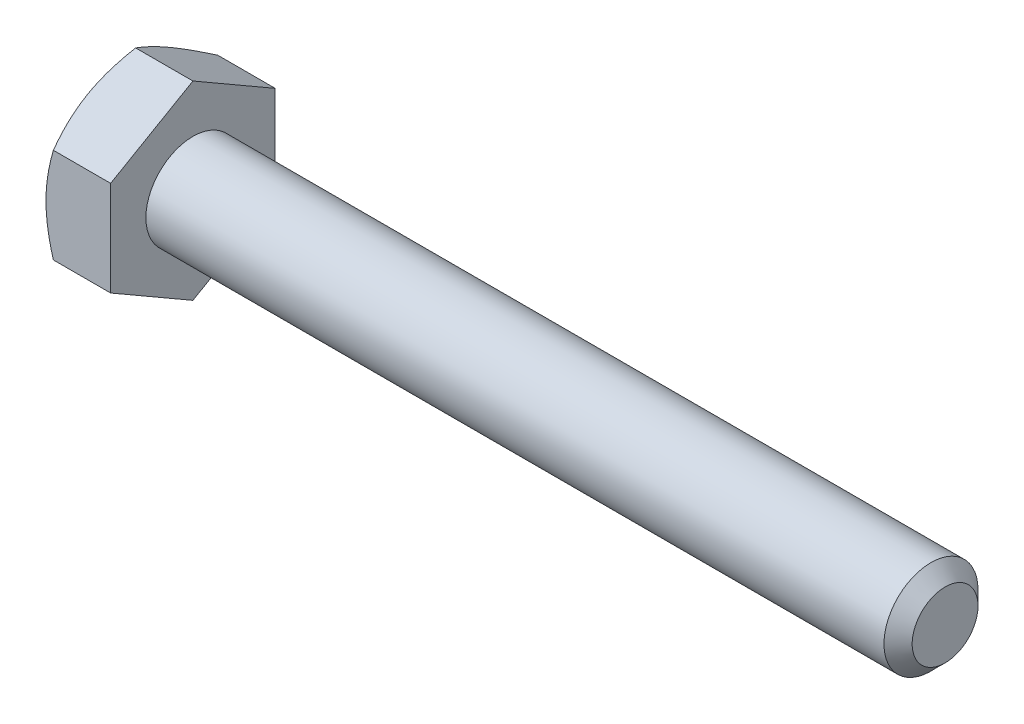
ISO-10303-21;
HEADER;
FILE_DESCRIPTION(('STEP AP214'),'2;1');
FILE_NAME('part.step','',(''),(''),'','','');
FILE_SCHEMA(('AUTOMOTIVE_DESIGN { 1 0 10303 214 1 1 1 1 }'));
ENDSEC;
DATA;
#1=APPLICATION_CONTEXT('core data for automotive mechanical design processes');
#2=APPLICATION_PROTOCOL_DEFINITION('international standard','automotive_design',2000,#1);
#3=PRODUCT_CONTEXT('',#1,'mechanical');
#4=PRODUCT('Part','Part','',(#3));
#5=PRODUCT_RELATED_PRODUCT_CATEGORY('part','',(#4));
#6=PRODUCT_DEFINITION_FORMATION('','',#4);
#7=PRODUCT_DEFINITION_CONTEXT('part definition',#1,'design');
#8=PRODUCT_DEFINITION('design','',#6,#7);
#9=PRODUCT_DEFINITION_SHAPE('','',#8);
#10=(LENGTH_UNIT() NAMED_UNIT(*) SI_UNIT(.MILLI.,.METRE.));
#11=(NAMED_UNIT(*) PLANE_ANGLE_UNIT() SI_UNIT($,.RADIAN.));
#12=(NAMED_UNIT(*) SI_UNIT($,.STERADIAN.) SOLID_ANGLE_UNIT());
#13=UNCERTAINTY_MEASURE_WITH_UNIT(LENGTH_MEASURE(1.E-05),#10,'distance_accuracy_value','');
#14=(GEOMETRIC_REPRESENTATION_CONTEXT(3) GLOBAL_UNCERTAINTY_ASSIGNED_CONTEXT((#13)) GLOBAL_UNIT_ASSIGNED_CONTEXT((#10,
#11,#12)) REPRESENTATION_CONTEXT('',''));
#15=CARTESIAN_POINT('',(0.,0.,0.));
#16=DIRECTION('',(0.,0.,1.));
#17=DIRECTION('',(1.,0.,0.));
#18=AXIS2_PLACEMENT_3D('',#15,#16,#17);
#19=CARTESIAN_POINT('',(-27.5828125,-3.20790243318486,5.55625));
#20=DIRECTION('',(0.,0.,-1.));
#21=DIRECTION('',(0.,1.,0.));
#22=AXIS2_PLACEMENT_3D('',#19,#20,#21);
#23=PLANE('',#22);
#24=CARTESIAN_POINT('',(-24.8093750574616,-8.74399028271724,5.55625));
#25=CARTESIAN_POINT('',(-24.9281476439003,-8.50018624433215,5.55625));
#26=CARTESIAN_POINT('',(-25.0458174877412,-8.25583594838018,5.55625));
#27=CARTESIAN_POINT('',(-25.2783338302931,-7.76575276181023,5.55625));
#28=CARTESIAN_POINT('',(-25.393179907504,-7.52001967143121,5.55625));
#29=CARTESIAN_POINT('',(-25.6199815650906,-7.02567502758554,5.55625));
#30=CARTESIAN_POINT('',(-25.7319190754759,-6.77705515601886,5.55625));
#31=CARTESIAN_POINT('',(-25.9513791438231,-6.27788161359691,5.55625));
#32=CARTESIAN_POINT('',(-26.0589019023311,-6.02732803119864,5.55625));
#33=CARTESIAN_POINT('',(-26.271906896146,-5.51539046667091,5.55625));
#34=CARTESIAN_POINT('',(-26.3771977000269,-5.25392641272659,5.55625));
#35=CARTESIAN_POINT('',(-26.5801139851458,-4.72798657849262,5.55625));
#36=CARTESIAN_POINT('',(-26.6777386244234,-4.46351047103702,5.55625));
#37=CARTESIAN_POINT('',(-26.8628532154484,-3.931581690416,5.55625));
#38=CARTESIAN_POINT('',(-26.9503626154158,-3.66413585057298,5.55625));
#39=CARTESIAN_POINT('',(-27.1125224423586,-3.12540698347402,5.55625));
#40=CARTESIAN_POINT('',(-27.187176786064,-2.85412515234023,5.55625));
#41=CARTESIAN_POINT('',(-27.3197361578849,-2.30908269853906,5.55625));
#42=CARTESIAN_POINT('',(-27.3777346690236,-2.03534517245376,5.55625));
#43=CARTESIAN_POINT('',(-27.4737733322196,-1.48429809984412,5.55625));
#44=CARTESIAN_POINT('',(-27.511815646564,-1.20698894364918,5.55625));
#45=CARTESIAN_POINT('',(-27.5513928026956,-0.791294728945893,5.55625));
#46=CARTESIAN_POINT('',(-27.561658902021,-0.65370820935704,5.55625));
#47=CARTESIAN_POINT('',(-27.576362187288,-0.378228688137562,5.55625));
#48=CARTESIAN_POINT('',(-27.5807999263983,-0.240335716836746,5.55625));
#49=CARTESIAN_POINT('',(-27.5837354775687,0.0355251316508514,5.55625));
#50=CARTESIAN_POINT('',(-27.5822327727923,0.173493014310982,5.55625));
#51=CARTESIAN_POINT('',(-27.5733265100424,0.4492284470335,5.55625));
#52=CARTESIAN_POINT('',(-27.5659231814189,0.586996004673772,5.55625));
#53=CARTESIAN_POINT('',(-27.5414869355163,0.914267817860304,5.55625));
#54=CARTESIAN_POINT('',(-27.5218672237309,1.10358331302688,5.55625));
#55=CARTESIAN_POINT('',(-27.4725268119308,1.48088314390515,5.55625));
#56=CARTESIAN_POINT('',(-27.4428048473206,1.66886730995275,5.55625));
#57=CARTESIAN_POINT('',(-27.3400555513119,2.23056094001761,5.55625));
#58=CARTESIAN_POINT('',(-27.2534606125147,2.60182550045217,5.55625));
#59=CARTESIAN_POINT('',(-27.1023261053987,3.15725729103479,5.55625));
#60=CARTESIAN_POINT('',(-27.0476586113424,3.34427702524158,5.55625));
#61=CARTESIAN_POINT('',(-26.932406052333,3.71650215163137,5.55625));
#62=CARTESIAN_POINT('',(-26.8718209419117,3.90170752986172,5.55625));
#63=CARTESIAN_POINT('',(-26.7457250457604,4.27035971442928,5.55625));
#64=CARTESIAN_POINT('',(-26.6802156550753,4.45380700235122,5.55625));
#65=CARTESIAN_POINT('',(-26.5450659129719,4.81916376783227,5.55625));
#66=CARTESIAN_POINT('',(-26.4754256552842,5.00107328017708,5.55625));
#67=CARTESIAN_POINT('',(-26.2830333948252,5.48965634412822,5.55625));
#68=CARTESIAN_POINT('',(-26.1570472750788,5.79505516029649,5.55625));
#69=CARTESIAN_POINT('',(-25.8976962832958,6.40271511827116,5.55625));
#70=CARTESIAN_POINT('',(-25.7643305993156,6.7049759104509,5.55625));
#71=CARTESIAN_POINT('',(-25.4919631126131,7.30707795631466,5.55625));
#72=CARTESIAN_POINT('',(-25.3529591769931,7.60691824193362,5.55625));
#73=CARTESIAN_POINT('',(-25.0706603632321,8.20455030388994,5.55625));
#74=CARTESIAN_POINT('',(-24.9273656584325,8.50234216238502,5.55625));
#75=CARTESIAN_POINT('',(-24.637187083384,9.09675870347433,5.55625));
#76=CARTESIAN_POINT('',(-24.4902978378226,9.39338075659062,5.55625));
#77=CARTESIAN_POINT('',(-24.1938414750758,9.98528417706332,5.55625));
#78=CARTESIAN_POINT('',(-24.0442743357868,10.2805655333282,5.55625));
#79=CARTESIAN_POINT('',(-23.5924394244542,11.1646418998589,5.55625));
#80=CARTESIAN_POINT('',(-23.2869729994491,11.7518013892495,5.55625));
#81=CARTESIAN_POINT('',(-22.7028679574184,12.8613257589912,5.55625));
#82=CARTESIAN_POINT('',(-22.4247985829024,13.3839917749348,5.55625));
#83=CARTESIAN_POINT('',(-21.8653014266466,14.4275635287064,5.55625));
#84=CARTESIAN_POINT('',(-21.5838734397935,14.9484691565073,5.55625));
#85=CARTESIAN_POINT('',(-21.0194769924016,15.9871873035495,5.55625));
#86=CARTESIAN_POINT('',(-20.7365168337456,16.5050043408021,5.55625));
#87=CARTESIAN_POINT('',(-20.1686898642822,17.5395393833806,5.55625));
#88=CARTESIAN_POINT('',(-19.8838232052305,18.0562574719669,5.55625));
#89=CARTESIAN_POINT('',(-19.59826235051,18.5725892213169,5.55625));
#90=B_SPLINE_CURVE_WITH_KNOTS('',3,(#24,#25,#26,#27,#28,#29,#30,#31,#32,#33,#34,#35,#36,#37,#38,
#39,#40,#41,#42,#43,#44,#45,#46,#47,#48,#49,#50,#51,#52,#53,#54,#55,#56,#57,#58,#59,#60,#61,#62,
#63,#64,#65,#66,#67,#68,#69,#70,#71,#72,#73,#74,#75,#76,#77,#78,#79,#80,#81,#82,#83,#84,#85,#86,
#87,#88,#89),.UNSPECIFIED.,.F.,.F.,(4,2,2,2,2,2,2,2,2,2,2,2,2,2,2,2,2,2,2,2,2,2,2,2,2,2,2,2,2,2,
2,2,4),(0.,0.813597716445731,1.6273161491936,2.44525275827227,3.26315217028694,4.10866348233596,
4.95426752580813,5.79821771718856,6.64191031370899,7.48077064504382,8.31954006567861,
8.73334238532056,9.14710542821066,9.56090447051724,9.97468742974187,10.545356138106,
11.1160963088497,12.258134229421,12.842619474887,13.4271092116055,14.0114339823823,
14.5957454997084,15.5866951993033,16.5777541467498,17.5691915643883,18.5605889831377,
19.5535724737812,20.5465641644216,22.5321054869692,24.3081902186865,26.0843839782317,
27.8546363211013,29.6247493906644),.UNSPECIFIED.);
#91=CARTESIAN_POINT('',(-27.0865482665182,-3.20790243318486,5.55625));
#92=VERTEX_POINT('',#91);
#93=CARTESIAN_POINT('',(-27.5828125,0.,5.55625));
#94=VERTEX_POINT('',#93);
#95=EDGE_CURVE('E249',#92,#94,#90,.T.);
#96=ORIENTED_EDGE('',*,*,#95,.F.);
#97=DIRECTION('',(1.,0.,0.));
#98=VECTOR('',#97,1.);
#99=CARTESIAN_POINT('',(-27.5828125,-3.20790243318486,5.55625));
#100=LINE('',#99,#98);
#101=CARTESIAN_POINT('',(-23.2171875,-3.20790243318486,5.55625));
#102=VERTEX_POINT('',#101);
#103=EDGE_CURVE('E232',#92,#102,#100,.T.);
#104=ORIENTED_EDGE('',*,*,#103,.T.);
#105=DIRECTION('',(0.,1.,0.));
#106=VECTOR('',#105,1.);
#107=CARTESIAN_POINT('',(-23.2171875,-3.20790243318486,5.55625));
#108=LINE('',#107,#106);
#109=CARTESIAN_POINT('',(-23.2171875,3.20790243318486,5.55625));
#110=VERTEX_POINT('',#109);
#111=EDGE_CURVE('E247',#102,#110,#108,.T.);
#112=ORIENTED_EDGE('',*,*,#111,.T.);
#113=DIRECTION('',(1.,0.,0.));
#114=VECTOR('',#113,1.);
#115=CARTESIAN_POINT('',(-27.5828125,3.20790243318486,5.55625));
#116=LINE('',#115,#114);
#117=CARTESIAN_POINT('',(-27.0865482665182,3.20790243318486,5.55625));
#118=VERTEX_POINT('',#117);
#119=EDGE_CURVE('E223',#118,#110,#116,.T.);
#120=ORIENTED_EDGE('',*,*,#119,.F.);
#121=EDGE_CURVE('E109',#94,#118,#90,.T.);
#122=ORIENTED_EDGE('',*,*,#121,.F.);
#123=EDGE_LOOP('',(#96,#104,#112,#120,#122));
#124=FACE_BOUND('',#123,.T.);
#125=ADVANCED_FACE('F33',(#124),#23,.F.);
#126=CARTESIAN_POINT('',(-27.5828125,3.20790243318486,5.55625));
#127=DIRECTION('',(0.,-0.866025403784439,-0.5));
#128=DIRECTION('',(0.,0.5,-0.866025403784439));
#129=AXIS2_PLACEMENT_3D('',#126,#127,#128);
#130=PLANE('',#129);
#131=CARTESIAN_POINT('',(-27.0864815980518,3.20778696313102,5.55645));
#132=CARTESIAN_POINT('',(-27.1271869396287,3.27830048099899,5.43431700443227));
#133=CARTESIAN_POINT('',(-27.1660449606368,3.34907690760433,5.31172863757365));
#134=CARTESIAN_POINT('',(-27.2395575665754,3.49120454378005,5.06555635055764));
#135=CARTESIAN_POINT('',(-27.2742103381981,3.56255598725623,4.94197202526351));
#136=CARTESIAN_POINT('',(-27.3711806144389,3.7777527611819,4.56924027919934));
#137=CARTESIAN_POINT('',(-27.426336445498,3.92244755263586,4.3186215488105));
#138=CARTESIAN_POINT('',(-27.491013595153,4.13898067940739,3.94357517172046));
#139=CARTESIAN_POINT('',(-27.5094383296374,4.21017202280889,3.82026814788998));
#140=CARTESIAN_POINT('',(-27.5403341337596,4.35287639627881,3.57309692257779));
#141=CARTESIAN_POINT('',(-27.552805729438,4.42438939736052,3.44923277130254));
#142=CARTESIAN_POINT('',(-27.5714774134017,4.56753961185542,3.20128932668298));
#143=CARTESIAN_POINT('',(-27.5776846193166,4.63917659144933,3.07721043832556));
#144=CARTESIAN_POINT('',(-27.5837010825862,4.7825127822332,2.82894487332451));
#145=CARTESIAN_POINT('',(-27.5835105375727,4.85421199143242,2.70475820012895));
#146=CARTESIAN_POINT('',(-27.5741942573071,5.05064720059278,2.36452243746779));
#147=CARTESIAN_POINT('',(-27.5585528403106,5.1753189069971,2.14858470770919));
#148=CARTESIAN_POINT('',(-27.5089525950254,5.42383425573454,1.71814349723526));
#149=CARTESIAN_POINT('',(-27.4749768117333,5.54767702400135,1.50364153044716));
#150=CARTESIAN_POINT('',(-27.3900467499519,5.79669255822861,1.07233397329164));
#151=CARTESIAN_POINT('',(-27.3387326119579,5.92183390122649,0.855582809091898));
#152=CARTESIAN_POINT('',(-27.2222700447076,6.17025031750737,0.425312954659247));
#153=CARTESIAN_POINT('',(-27.1571489741206,6.29352857247572,0.21178875358562));
#154=CARTESIAN_POINT('',(-27.0864815980518,6.41592033642356,-0.000200000000001475));
#155=B_SPLINE_CURVE_WITH_KNOTS('',3,(#131,#132,#133,#134,#135,#136,#137,#138,#139,#140,#141,
#142,#143,#144,#145,#146,#147,#148,#149,#150,#151,#152,#153,#154),.UNSPECIFIED.,.F.,.F.,(4,2,2,
2,2,2,2,2,2,2,2,4),(0.,0.440316908268042,0.880823012040824,1.76366572331169,2.19427472390783,
2.62484566732156,3.05492684132792,3.48499472977669,4.23370964386675,4.98311813377593,
5.74914806559356,6.51367405016873),.UNSPECIFIED.);
#156=CARTESIAN_POINT('',(-27.5828125,4.81185364977729,2.778125));
#157=VERTEX_POINT('',#156);
#158=EDGE_CURVE('E105',#118,#157,#155,.T.);
#159=ORIENTED_EDGE('',*,*,#158,.F.);
#160=ORIENTED_EDGE('',*,*,#119,.T.);
#161=DIRECTION('',(0.,0.5,-0.866025403784439));
#162=VECTOR('',#161,1.);
#163=CARTESIAN_POINT('',(-23.2171875,3.20790243318486,5.55625));
#164=LINE('',#163,#162);
#165=CARTESIAN_POINT('',(-23.2171875,6.41580486636972,0.));
#166=VERTEX_POINT('',#165);
#167=EDGE_CURVE('E246',#110,#166,#164,.T.);
#168=ORIENTED_EDGE('',*,*,#167,.T.);
#169=DIRECTION('',(1.,0.,0.));
#170=VECTOR('',#169,1.);
#171=CARTESIAN_POINT('',(-27.5828125,6.41580486636972,0.));
#172=LINE('',#171,#170);
#173=CARTESIAN_POINT('',(-27.0865482665182,6.41580486636972,0.));
#174=VERTEX_POINT('',#173);
#175=EDGE_CURVE('E128',#174,#166,#172,.T.);
#176=ORIENTED_EDGE('',*,*,#175,.F.);
#177=EDGE_CURVE('E113',#157,#174,#155,.T.);
#178=ORIENTED_EDGE('',*,*,#177,.F.);
#179=EDGE_LOOP('',(#159,#160,#168,#176,#178));
#180=FACE_BOUND('',#179,.T.);
#181=ADVANCED_FACE('F126',(#180),#130,.F.);
#182=CARTESIAN_POINT('',(-27.5828125,6.41580486636972,0.));
#183=DIRECTION('',(0.,-0.866025403784439,0.5));
#184=DIRECTION('',(0.,-0.5,-0.866025403784439));
#185=AXIS2_PLACEMENT_3D('',#182,#183,#184);
#186=PLANE('',#185);
#187=CARTESIAN_POINT('',(-27.0864815980518,6.41592033642356,0.00019999999999889));
#188=CARTESIAN_POINT('',(-27.1271869396287,6.34540681855559,-0.121932995567732));
#189=CARTESIAN_POINT('',(-27.1660449606368,6.27463039195025,-0.244521362426354));
#190=CARTESIAN_POINT('',(-27.2395575665754,6.13250275577453,-0.490693649442357));
#191=CARTESIAN_POINT('',(-27.2742103381981,6.06115131229835,-0.614277974736489));
#192=CARTESIAN_POINT('',(-27.3711806144389,5.84595453837268,-0.987009720800664));
#193=CARTESIAN_POINT('',(-27.426336445498,5.70125974691872,-1.2376284511895));
#194=CARTESIAN_POINT('',(-27.491013595153,5.48472662014719,-1.61267482827954));
#195=CARTESIAN_POINT('',(-27.5094383296374,5.41353527674569,-1.73598185211003));
#196=CARTESIAN_POINT('',(-27.5403341337596,5.27083090327577,-1.98315307742222));
#197=CARTESIAN_POINT('',(-27.552805729438,5.19931790219406,-2.10701722869746));
#198=CARTESIAN_POINT('',(-27.5714774134017,5.05616768769916,-2.35496067331702));
#199=CARTESIAN_POINT('',(-27.5776846193166,4.98453070810525,-2.47903956167444));
#200=CARTESIAN_POINT('',(-27.5837010825862,4.84119451732138,-2.72730512667549));
#201=CARTESIAN_POINT('',(-27.5835105375727,4.76949530812216,-2.85149179987105));
#202=CARTESIAN_POINT('',(-27.5741942573071,4.5730600989618,-3.19172756253221));
#203=CARTESIAN_POINT('',(-27.5585528403106,4.44838839255747,-3.40766529229081));
#204=CARTESIAN_POINT('',(-27.5089525950254,4.19987304382004,-3.83810650276474));
#205=CARTESIAN_POINT('',(-27.4749768117333,4.07603027555323,-4.05260846955284));
#206=CARTESIAN_POINT('',(-27.3900467499519,3.82701474132597,-4.48391602670836));
#207=CARTESIAN_POINT('',(-27.3387326119579,3.70187339832808,-4.7006671909081));
#208=CARTESIAN_POINT('',(-27.2222700447076,3.45345698204721,-5.13093704534075));
#209=CARTESIAN_POINT('',(-27.1571489741206,3.33017872707885,-5.34446124641438));
#210=CARTESIAN_POINT('',(-27.0864815980518,3.20778696313102,-5.55645));
#211=B_SPLINE_CURVE_WITH_KNOTS('',3,(#187,#188,#189,#190,#191,#192,#193,#194,#195,#196,#197,
#198,#199,#200,#201,#202,#203,#204,#205,#206,#207,#208,#209,#210),.UNSPECIFIED.,.F.,.F.,(4,2,2,
2,2,2,2,2,2,2,2,4),(0.,0.440316908268041,0.880823012040824,1.76366572331169,2.19427472390783,
2.62484566732156,3.05492684132792,3.4849947297767,4.23370964386675,4.98311813377593,
5.74914806559356,6.51367405016873),.UNSPECIFIED.);
#212=CARTESIAN_POINT('',(-27.5828125,4.81185364977729,-2.778125));
#213=VERTEX_POINT('',#212);
#214=EDGE_CURVE('E118',#174,#213,#211,.T.);
#215=ORIENTED_EDGE('',*,*,#214,.F.);
#216=ORIENTED_EDGE('',*,*,#175,.T.);
#217=DIRECTION('',(0.,-0.5,-0.866025403784439));
#218=VECTOR('',#217,1.);
#219=CARTESIAN_POINT('',(-23.2171875,6.41580486636972,0.));
#220=LINE('',#219,#218);
#221=CARTESIAN_POINT('',(-23.2171875,3.20790243318486,-5.55625));
#222=VERTEX_POINT('',#221);
#223=EDGE_CURVE('E243',#166,#222,#220,.T.);
#224=ORIENTED_EDGE('',*,*,#223,.T.);
#225=DIRECTION('',(1.,0.,0.));
#226=VECTOR('',#225,1.);
#227=CARTESIAN_POINT('',(-27.5828125,3.20790243318486,-5.55625));
#228=LINE('',#227,#226);
#229=CARTESIAN_POINT('',(-27.0865482665182,3.20790243318486,-5.55625));
#230=VERTEX_POINT('',#229);
#231=EDGE_CURVE('E226',#230,#222,#228,.T.);
#232=ORIENTED_EDGE('',*,*,#231,.F.);
#233=EDGE_CURVE('E129',#213,#230,#211,.T.);
#234=ORIENTED_EDGE('',*,*,#233,.F.);
#235=EDGE_LOOP('',(#215,#216,#224,#232,#234));
#236=FACE_BOUND('',#235,.T.);
#237=ADVANCED_FACE('F183',(#236),#186,.F.);
#238=CARTESIAN_POINT('',(-27.5828125,3.20790243318486,-5.55625));
#239=DIRECTION('',(0.,0.,1.));
#240=DIRECTION('',(0.,-1.,0.));
#241=AXIS2_PLACEMENT_3D('',#238,#239,#240);
#242=PLANE('',#241);
#243=CARTESIAN_POINT('',(-24.8093750598475,-8.74399027782085,-5.55625));
#244=CARTESIAN_POINT('',(-24.9281476461868,-8.50018623960062,-5.55625));
#245=CARTESIAN_POINT('',(-25.0458174899284,-8.25583594381362,-5.55625));
#246=CARTESIAN_POINT('',(-25.278333832282,-7.76575275757412,-5.55625));
#247=CARTESIAN_POINT('',(-25.393179909394,-7.52001966736056,-5.55625));
#248=CARTESIAN_POINT('',(-25.6199815667827,-7.02567502384834,-5.55625));
#249=CARTESIAN_POINT('',(-25.7319190770691,-6.77705515244963,-5.55625));
#250=CARTESIAN_POINT('',(-25.9513791452201,-6.27788161036475,-5.55625));
#251=CARTESIAN_POINT('',(-26.0589019036307,-6.02732802813559,-5.55625));
#252=CARTESIAN_POINT('',(-26.2719068972481,-5.51539046395943,-5.55625));
#253=CARTESIAN_POINT('',(-26.377197701029,-5.25392641019769,-5.55625));
#254=CARTESIAN_POINT('',(-26.5801139859531,-4.72798657633179,-5.55625));
#255=CARTESIAN_POINT('',(-26.6777386251359,-4.46351046906169,-5.55625));
#256=CARTESIAN_POINT('',(-26.8628532159805,-3.93158168881508,-5.55625));
#257=CARTESIAN_POINT('',(-26.9503626158621,-3.66413584916097,-5.55625));
#258=CARTESIAN_POINT('',(-27.1125224426472,-3.12540698244495,-5.55625));
#259=CARTESIAN_POINT('',(-27.1871767862806,-2.8541251515052,-5.55625));
#260=CARTESIAN_POINT('',(-27.3197361579561,-2.30908269819076,-5.55625));
#261=CARTESIAN_POINT('',(-27.3777346690269,-2.03534517239951,-5.55625));
#262=CARTESIAN_POINT('',(-27.4737733321313,-1.4842981003853,-5.55625));
#263=CARTESIAN_POINT('',(-27.5118156464521,-1.20698894449172,-5.55625));
#264=CARTESIAN_POINT('',(-27.5513928025883,-0.791294730238441,-5.55625));
#265=CARTESIAN_POINT('',(-27.5616589019217,-0.653708210797407,-5.55625));
#266=CARTESIAN_POINT('',(-27.5763621872177,-0.378228689873302,-5.55625));
#267=CARTESIAN_POINT('',(-27.5807999263492,-0.240335718720038,-5.55625));
#268=CARTESIAN_POINT('',(-27.5837354775746,0.0355251294734949,-5.55625));
#269=CARTESIAN_POINT('',(-27.5822327728321,0.173493011987115,-5.55625));
#270=CARTESIAN_POINT('',(-27.573326510162,0.449228444418533,-5.55625));
#271=CARTESIAN_POINT('',(-27.5659231815845,0.586996001914218,-5.55625));
#272=CARTESIAN_POINT('',(-27.5414869357947,0.914267814879,-5.55625));
#273=CARTESIAN_POINT('',(-27.5218672240741,1.10358330996904,-5.55625));
#274=CARTESIAN_POINT('',(-27.472526812407,1.48088314069774,-5.55625));
#275=CARTESIAN_POINT('',(-27.4428048478651,1.66886730667232,-5.55625));
#276=CARTESIAN_POINT('',(-27.3400555520625,2.23056093652212,-5.55625));
#277=CARTESIAN_POINT('',(-27.2534606134045,2.60182549681906,-5.55625));
#278=CARTESIAN_POINT('',(-27.1023261064939,3.15725728719582,-5.55625));
#279=CARTESIAN_POINT('',(-27.0476586125065,3.34427702133249,-5.55625));
#280=CARTESIAN_POINT('',(-26.9324060536328,3.71650214758286,-5.55625));
#281=CARTESIAN_POINT('',(-26.8718209432783,3.9017075257439,-5.55625));
#282=CARTESIAN_POINT('',(-26.745725047258,4.27035971017338,-5.55625));
#283=CARTESIAN_POINT('',(-26.6802156566373,4.45380699802654,-5.55625));
#284=CARTESIAN_POINT('',(-26.5450659146602,4.81916376337002,-5.55625));
#285=CARTESIAN_POINT('',(-26.4754256570347,5.00107327564604,-5.55625));
#286=CARTESIAN_POINT('',(-26.2830333966823,5.48965633955828,-5.55625));
#287=CARTESIAN_POINT('',(-26.1570472769738,5.79505515575441,-5.55625));
#288=CARTESIAN_POINT('',(-25.8976962852557,6.4027151137812,-5.55625));
#289=CARTESIAN_POINT('',(-25.7643306013023,6.7049759059852,-5.55625));
#290=CARTESIAN_POINT('',(-25.4919631146457,7.30707795189491,-5.55625));
#291=CARTESIAN_POINT('',(-25.3529591790448,7.60691823753554,-5.55625));
#292=CARTESIAN_POINT('',(-25.0706603653161,8.20455029953286,-5.55625));
#293=CARTESIAN_POINT('',(-24.9273656605298,8.50234215804727,-5.55625));
#294=CARTESIAN_POINT('',(-24.6371870855033,9.09675869917466,-5.55625));
#295=CARTESIAN_POINT('',(-24.4902978399505,9.3933807523097,-5.55625));
#296=CARTESIAN_POINT('',(-24.193841477218,9.98528417281851,-5.55625));
#297=CARTESIAN_POINT('',(-24.0442743379345,10.2805655291008,-5.55625));
#298=CARTESIAN_POINT('',(-23.5924394266152,11.1646418956815,-5.55625));
#299=CARTESIAN_POINT('',(-23.2869730016145,11.7518013851031,-5.55625));
#300=CARTESIAN_POINT('',(-22.7028679596005,12.8613257548756,-5.55625));
#301=CARTESIAN_POINT('',(-22.4247985850974,13.3839917708193,-5.55625));
#302=CARTESIAN_POINT('',(-21.865301428865,14.42756352459,-5.55625));
#303=CARTESIAN_POINT('',(-21.5838734420221,14.9484691523898,-5.55625));
#304=CARTESIAN_POINT('',(-21.0194769946515,15.9871872994245,-5.55625));
#305=CARTESIAN_POINT('',(-20.7365168360065,16.5050043366708,-5.55625));
#306=CARTESIAN_POINT('',(-20.1686898665637,17.5395393792358,-5.55625));
#307=CARTESIAN_POINT('',(-19.8838232075218,18.056257467815,-5.55625));
#308=CARTESIAN_POINT('',(-19.5982623528106,18.5725892171576,-5.55625));
#309=B_SPLINE_CURVE_WITH_KNOTS('',3,(#243,#244,#245,#246,#247,#248,#249,#250,#251,#252,#253,
#254,#255,#256,#257,#258,#259,#260,#261,#262,#263,#264,#265,#266,#267,#268,#269,#270,#271,#272,
#273,#274,#275,#276,#277,#278,#279,#280,#281,#282,#283,#284,#285,#286,#287,#288,#289,#290,#291,
#292,#293,#294,#295,#296,#297,#298,#299,#300,#301,#302,#303,#304,#305,#306,#307,#308),
.UNSPECIFIED.,.F.,.F.,(4,2,2,2,2,2,2,2,2,2,2,2,2,2,2,2,2,2,2,2,2,2,2,2,2,2,2,2,2,2,2,2,4),(0.,
0.813597715870463,1.62731614804298,2.44525275654031,3.26315216797368,4.10866347940256,
4.95426752225437,5.79821771301645,6.64191030891902,7.48077063935046,8.31954005908317,
8.73334237828505,9.14710542073519,9.56090446260155,9.97468742138601,10.5453561295019,
11.1160962999972,12.2581342200709,12.8426194652768,13.4271092017353,14.0114339722529,
14.5957454893196,15.5866951889479,16.5777541364282,17.5691915541016,18.5605889728859,
19.5535724635683,20.5465641542476,22.5321054768716,24.308190208571,26.0843839680985,
27.8546363109357,29.624749380466),.UNSPECIFIED.);
#310=CARTESIAN_POINT('',(-27.5828125,0.,-5.55625));
#311=VERTEX_POINT('',#310);
#312=EDGE_CURVE('E177',#230,#311,#309,.F.);
#313=ORIENTED_EDGE('',*,*,#312,.F.);
#314=ORIENTED_EDGE('',*,*,#231,.T.);
#315=DIRECTION('',(0.,-1.,0.));
#316=VECTOR('',#315,1.);
#317=CARTESIAN_POINT('',(-23.2171875,3.20790243318486,-5.55625));
#318=LINE('',#317,#316);
#319=CARTESIAN_POINT('',(-23.2171875,-3.20790243318486,-5.55625));
#320=VERTEX_POINT('',#319);
#321=EDGE_CURVE('E240',#222,#320,#318,.T.);
#322=ORIENTED_EDGE('',*,*,#321,.T.);
#323=DIRECTION('',(1.,0.,0.));
#324=VECTOR('',#323,1.);
#325=CARTESIAN_POINT('',(-27.5828125,-3.20790243318486,-5.55625));
#326=LINE('',#325,#324);
#327=CARTESIAN_POINT('',(-27.0865482665182,-3.20790243318486,-5.55625));
#328=VERTEX_POINT('',#327);
#329=EDGE_CURVE('E228',#328,#320,#326,.T.);
#330=ORIENTED_EDGE('',*,*,#329,.F.);
#331=EDGE_CURVE('E172',#311,#328,#309,.F.);
#332=ORIENTED_EDGE('',*,*,#331,.F.);
#333=EDGE_LOOP('',(#313,#314,#322,#330,#332));
#334=FACE_BOUND('',#333,.T.);
#335=ADVANCED_FACE('F179',(#334),#242,.F.);
#336=CARTESIAN_POINT('',(-27.5828125,-3.20790243318486,-5.55625));
#337=DIRECTION('',(0.,0.866025403784439,0.5));
#338=DIRECTION('',(0.,-0.5,0.866025403784439));
#339=AXIS2_PLACEMENT_3D('',#336,#337,#338);
#340=PLANE('',#339);
#341=CARTESIAN_POINT('',(-27.0864815980518,-3.20778696313102,-5.55645));
#342=CARTESIAN_POINT('',(-27.1271869396287,-3.27830048099899,-5.43431700443227));
#343=CARTESIAN_POINT('',(-27.1660449606368,-3.34907690760433,-5.31172863757365));
#344=CARTESIAN_POINT('',(-27.2395575665754,-3.49120454378004,-5.06555635055765));
#345=CARTESIAN_POINT('',(-27.2742103381981,-3.56255598725623,-4.94197202526351));
#346=CARTESIAN_POINT('',(-27.3711806144389,-3.7777527611819,-4.56924027919934));
#347=CARTESIAN_POINT('',(-27.426336445498,-3.92244755263586,-4.3186215488105));
#348=CARTESIAN_POINT('',(-27.491013595153,-4.13898067940738,-3.94357517172046));
#349=CARTESIAN_POINT('',(-27.5094383296374,-4.21017202280889,-3.82026814788998));
#350=CARTESIAN_POINT('',(-27.5403341337596,-4.35287639627881,-3.57309692257778));
#351=CARTESIAN_POINT('',(-27.552805729438,-4.42438939736052,-3.44923277130254));
#352=CARTESIAN_POINT('',(-27.5714774134017,-4.56753961185542,-3.20128932668298));
#353=CARTESIAN_POINT('',(-27.5776846193166,-4.63917659144933,-3.07721043832556));
#354=CARTESIAN_POINT('',(-27.5837010825862,-4.7825127822332,-2.82894487332451));
#355=CARTESIAN_POINT('',(-27.5835105375727,-4.85421199143242,-2.70475820012895));
#356=CARTESIAN_POINT('',(-27.5741942573071,-5.05064720059278,-2.36452243746779));
#357=CARTESIAN_POINT('',(-27.5585528403106,-5.1753189069971,-2.14858470770919));
#358=CARTESIAN_POINT('',(-27.5089525950254,-5.42383425573454,-1.71814349723526));
#359=CARTESIAN_POINT('',(-27.4749768117333,-5.54767702400135,-1.50364153044716));
#360=CARTESIAN_POINT('',(-27.3900467499519,-5.79669255822861,-1.07233397329164));
#361=CARTESIAN_POINT('',(-27.3387326119579,-5.92183390122649,-0.855582809091898));
#362=CARTESIAN_POINT('',(-27.2222700447076,-6.17025031750737,-0.425312954659247));
#363=CARTESIAN_POINT('',(-27.1571489741206,-6.29352857247572,-0.211788753585621));
#364=CARTESIAN_POINT('',(-27.0864815980518,-6.41592033642355,0.000199999999999272));
#365=B_SPLINE_CURVE_WITH_KNOTS('',3,(#341,#342,#343,#344,#345,#346,#347,#348,#349,#350,#351,
#352,#353,#354,#355,#356,#357,#358,#359,#360,#361,#362,#363,#364),.UNSPECIFIED.,.F.,.F.,(4,2,2,
2,2,2,2,2,2,2,2,4),(0.,0.440316908268042,0.880823012040823,1.76366572331169,2.19427472390783,
2.62484566732156,3.05492684132792,3.4849947297767,4.23370964386675,4.98311813377593,
5.74914806559357,6.51367405016873),.UNSPECIFIED.);
#366=CARTESIAN_POINT('',(-27.5828125,-4.81185364977729,-2.778125));
#367=VERTEX_POINT('',#366);
#368=EDGE_CURVE('E178',#328,#367,#365,.T.);
#369=ORIENTED_EDGE('',*,*,#368,.F.);
#370=ORIENTED_EDGE('',*,*,#329,.T.);
#371=DIRECTION('',(0.,-0.5,0.866025403784439));
#372=VECTOR('',#371,1.);
#373=CARTESIAN_POINT('',(-23.2171875,-3.20790243318486,-5.55625));
#374=LINE('',#373,#372);
#375=CARTESIAN_POINT('',(-23.2171875,-6.41580486636972,0.));
#376=VERTEX_POINT('',#375);
#377=EDGE_CURVE('E237',#320,#376,#374,.T.);
#378=ORIENTED_EDGE('',*,*,#377,.T.);
#379=DIRECTION('',(1.,0.,0.));
#380=VECTOR('',#379,1.);
#381=CARTESIAN_POINT('',(-27.5828125,-6.41580486636972,0.));
#382=LINE('',#381,#380);
#383=CARTESIAN_POINT('',(-27.0865482665182,-6.41580486636972,0.));
#384=VERTEX_POINT('',#383);
#385=EDGE_CURVE('E230',#384,#376,#382,.T.);
#386=ORIENTED_EDGE('',*,*,#385,.F.);
#387=EDGE_CURVE('E167',#367,#384,#365,.T.);
#388=ORIENTED_EDGE('',*,*,#387,.F.);
#389=EDGE_LOOP('',(#369,#370,#378,#386,#388));
#390=FACE_BOUND('',#389,.T.);
#391=ADVANCED_FACE('F182',(#390),#340,.F.);
#392=CARTESIAN_POINT('',(-27.5828125,-6.41580486636972,0.));
#393=DIRECTION('',(0.,0.866025403784439,-0.5));
#394=DIRECTION('',(0.,0.5,0.866025403784439));
#395=AXIS2_PLACEMENT_3D('',#392,#393,#394);
#396=PLANE('',#395);
#397=CARTESIAN_POINT('',(-27.0864815980518,-6.41592033642355,-0.000200000000000624));
#398=CARTESIAN_POINT('',(-27.1271869396287,-6.34540681855559,0.12193299556773));
#399=CARTESIAN_POINT('',(-27.1660449606368,-6.27463039195025,0.244521362426352));
#400=CARTESIAN_POINT('',(-27.2395575665754,-6.13250275577453,0.490693649442356));
#401=CARTESIAN_POINT('',(-27.2742103381981,-6.06115131229835,0.614277974736487));
#402=CARTESIAN_POINT('',(-27.3711806144389,-5.84595453837268,0.987009720800662));
#403=CARTESIAN_POINT('',(-27.426336445498,-5.70125974691872,1.2376284511895));
#404=CARTESIAN_POINT('',(-27.491013595153,-5.48472662014719,1.61267482827954));
#405=CARTESIAN_POINT('',(-27.5094383296374,-5.41353527674569,1.73598185211002));
#406=CARTESIAN_POINT('',(-27.5403341337596,-5.27083090327577,1.98315307742221));
#407=CARTESIAN_POINT('',(-27.552805729438,-5.19931790219406,2.10701722869746));
#408=CARTESIAN_POINT('',(-27.5714774134017,-5.05616768769916,2.35496067331702));
#409=CARTESIAN_POINT('',(-27.5776846193166,-4.98453070810525,2.47903956167444));
#410=CARTESIAN_POINT('',(-27.5837010825862,-4.84119451732138,2.72730512667549));
#411=CARTESIAN_POINT('',(-27.5835105375727,-4.76949530812216,2.85149179987105));
#412=CARTESIAN_POINT('',(-27.5741942573071,-4.5730600989618,3.19172756253221));
#413=CARTESIAN_POINT('',(-27.5585528403106,-4.44838839255747,3.40766529229081));
#414=CARTESIAN_POINT('',(-27.5089525950254,-4.19987304382004,3.83810650276474));
#415=CARTESIAN_POINT('',(-27.4749768117333,-4.07603027555323,4.05260846955284));
#416=CARTESIAN_POINT('',(-27.3900467499519,-3.82701474132597,4.48391602670836));
#417=CARTESIAN_POINT('',(-27.3387326119579,-3.70187339832808,4.7006671909081));
#418=CARTESIAN_POINT('',(-27.2222700447076,-3.45345698204721,5.13093704534075));
#419=CARTESIAN_POINT('',(-27.1571489741206,-3.33017872707885,5.34446124641438));
#420=CARTESIAN_POINT('',(-27.0864815980518,-3.20778696313102,5.55645));
#421=B_SPLINE_CURVE_WITH_KNOTS('',3,(#397,#398,#399,#400,#401,#402,#403,#404,#405,#406,#407,
#408,#409,#410,#411,#412,#413,#414,#415,#416,#417,#418,#419,#420),.UNSPECIFIED.,.F.,.F.,(4,2,2,
2,2,2,2,2,2,2,2,4),(0.,0.440316908268041,0.880823012040824,1.76366572331169,2.19427472390783,
2.62484566732156,3.05492684132792,3.48499472977669,4.23370964386674,4.98311813377593,
5.74914806559357,6.51367405016873),.UNSPECIFIED.);
#422=CARTESIAN_POINT('',(-27.5828125,-4.81185364977729,2.778125));
#423=VERTEX_POINT('',#422);
#424=EDGE_CURVE('E275',#384,#423,#421,.T.);
#425=ORIENTED_EDGE('',*,*,#424,.F.);
#426=ORIENTED_EDGE('',*,*,#385,.T.);
#427=DIRECTION('',(0.,0.5,0.866025403784439));
#428=VECTOR('',#427,1.);
#429=CARTESIAN_POINT('',(-23.2171875,-6.41580486636972,0.));
#430=LINE('',#429,#428);
#431=EDGE_CURVE('E234',#376,#102,#430,.T.);
#432=ORIENTED_EDGE('',*,*,#431,.T.);
#433=ORIENTED_EDGE('',*,*,#103,.F.);
#434=EDGE_CURVE('E123',#423,#92,#421,.T.);
#435=ORIENTED_EDGE('',*,*,#434,.F.);
#436=EDGE_LOOP('',(#425,#426,#432,#433,#435));
#437=FACE_BOUND('',#436,.T.);
#438=ADVANCED_FACE('F204',(#437),#396,.F.);
#439=CARTESIAN_POINT('',(-23.2171875,0.,0.));
#440=DIRECTION('',(1.,0.,0.));
#441=DIRECTION('',(0.,0.,-1.));
#442=AXIS2_PLACEMENT_3D('',#439,#440,#441);
#443=CYLINDRICAL_SURFACE('',#442,3.175);
#444=CARTESIAN_POINT('',(-23.2171875,0.,0.));
#445=DIRECTION('',(-1.,0.,0.));
#446=DIRECTION('',(0.,0.,1.));
#447=AXIS2_PLACEMENT_3D('',#444,#445,#446);
#448=CIRCLE('',#447,3.175);
#449=CARTESIAN_POINT('',(-23.2171875,0.,3.175));
#450=VERTEX_POINT('',#449);
#451=EDGE_CURVE('E213',#450,#450,#448,.F.);
#452=ORIENTED_EDGE('',*,*,#451,.T.);
#453=EDGE_LOOP('',(#452));
#454=FACE_BOUND('',#453,.T.);
#455=CARTESIAN_POINT('',(26.6303125,0.,0.));
#456=DIRECTION('',(1.,0.,0.));
#457=DIRECTION('',(0.,0.,-1.));
#458=AXIS2_PLACEMENT_3D('',#455,#456,#457);
#459=CIRCLE('',#458,3.175);
#460=CARTESIAN_POINT('',(26.6303125,0.,-3.175));
#461=VERTEX_POINT('',#460);
#462=EDGE_CURVE('E216',#461,#461,#459,.F.);
#463=ORIENTED_EDGE('',*,*,#462,.T.);
#464=EDGE_LOOP('',(#463));
#465=FACE_BOUND('',#464,.T.);
#466=ADVANCED_FACE('F201',(#454,#465),#443,.T.);
#467=CARTESIAN_POINT('',(27.5828125,0.,0.));
#468=DIRECTION('',(1.,0.,0.));
#469=DIRECTION('',(0.,0.,-1.));
#470=AXIS2_PLACEMENT_3D('',#467,#468,#469);
#471=PLANE('',#470);
#472=CARTESIAN_POINT('',(27.5828125,0.,0.));
#473=DIRECTION('',(1.,0.,0.));
#474=DIRECTION('',(0.,0.,-1.));
#475=AXIS2_PLACEMENT_3D('',#472,#473,#474);
#476=CIRCLE('',#475,2.2225);
#477=CARTESIAN_POINT('',(27.5828125,0.,-2.2225));
#478=VERTEX_POINT('',#477);
#479=EDGE_CURVE('E218',#478,#478,#476,.T.);
#480=ORIENTED_EDGE('',*,*,#479,.T.);
#481=EDGE_LOOP('',(#480));
#482=FACE_BOUND('',#481,.T.);
#483=ADVANCED_FACE('F199',(#482),#471,.T.);
#484=CARTESIAN_POINT('',(27.5828125,0.,0.));
#485=DIRECTION('',(-1.,0.,0.));
#486=DIRECTION('',(0.,0.,1.));
#487=AXIS2_PLACEMENT_3D('',#484,#485,#486);
#488=CONICAL_SURFACE('',#487,2.2225,0.78539816339745);
#489=ORIENTED_EDGE('',*,*,#462,.F.);
#490=EDGE_LOOP('',(#489));
#491=FACE_BOUND('',#490,.T.);
#492=ORIENTED_EDGE('',*,*,#479,.F.);
#493=EDGE_LOOP('',(#492));
#494=FACE_BOUND('',#493,.T.);
#495=ADVANCED_FACE('F35',(#491,#494),#488,.T.);
#496=CARTESIAN_POINT('',(-23.2171875,3.20790243318486,5.55625));
#497=DIRECTION('',(-1.,0.,0.));
#498=DIRECTION('',(0.,0.,1.));
#499=AXIS2_PLACEMENT_3D('',#496,#497,#498);
#500=PLANE('',#499);
#501=ORIENTED_EDGE('',*,*,#451,.F.);
#502=EDGE_LOOP('',(#501));
#503=FACE_BOUND('',#502,.T.);
#504=ORIENTED_EDGE('',*,*,#111,.F.);
#505=ORIENTED_EDGE('',*,*,#431,.F.);
#506=ORIENTED_EDGE('',*,*,#377,.F.);
#507=ORIENTED_EDGE('',*,*,#321,.F.);
#508=ORIENTED_EDGE('',*,*,#223,.F.);
#509=ORIENTED_EDGE('',*,*,#167,.F.);
#510=EDGE_LOOP('',(#504,#505,#506,#507,#508,#509));
#511=FACE_BOUND('',#510,.T.);
#512=ADVANCED_FACE('F153',(#503,#511),#500,.F.);
#513=CARTESIAN_POINT('',(-27.5828125,0.,0.));
#514=DIRECTION('',(1.,0.,0.));
#515=DIRECTION('',(0.,0.,1.));
#516=AXIS2_PLACEMENT_3D('',#513,#514,#515);
#517=CONICAL_SURFACE('',#516,5.55625,1.0471975511966);
#518=ORIENTED_EDGE('',*,*,#95,.T.);
#519=CARTESIAN_POINT('',(-27.5828125,0.,0.));
#520=DIRECTION('',(-1.,0.,0.));
#521=DIRECTION('',(0.,0.,1.));
#522=AXIS2_PLACEMENT_3D('',#519,#520,#521);
#523=CIRCLE('',#522,5.55625);
#524=EDGE_CURVE('E37',#423,#94,#523,.T.);
#525=ORIENTED_EDGE('',*,*,#524,.F.);
#526=ORIENTED_EDGE('',*,*,#434,.T.);
#527=EDGE_LOOP('',(#518,#525,#526));
#528=FACE_BOUND('',#527,.T.);
#529=ADVANCED_FACE('F148',(#528),#517,.T.);
#530=ORIENTED_EDGE('',*,*,#387,.T.);
#531=ORIENTED_EDGE('',*,*,#424,.T.);
#532=EDGE_CURVE('E57',#367,#423,#523,.T.);
#533=ORIENTED_EDGE('',*,*,#532,.F.);
#534=EDGE_LOOP('',(#530,#531,#533));
#535=FACE_BOUND('',#534,.T.);
#536=ADVANCED_FACE('F152',(#535),#517,.T.);
#537=ORIENTED_EDGE('',*,*,#331,.T.);
#538=ORIENTED_EDGE('',*,*,#368,.T.);
#539=EDGE_CURVE('E269',#311,#367,#523,.T.);
#540=ORIENTED_EDGE('',*,*,#539,.F.);
#541=EDGE_LOOP('',(#537,#538,#540));
#542=FACE_BOUND('',#541,.T.);
#543=ADVANCED_FACE('F270',(#542),#517,.T.);
#544=ORIENTED_EDGE('',*,*,#233,.T.);
#545=ORIENTED_EDGE('',*,*,#312,.T.);
#546=EDGE_CURVE('E42',#213,#311,#523,.T.);
#547=ORIENTED_EDGE('',*,*,#546,.F.);
#548=EDGE_LOOP('',(#544,#545,#547));
#549=FACE_BOUND('',#548,.T.);
#550=ADVANCED_FACE('F266',(#549),#517,.T.);
#551=ORIENTED_EDGE('',*,*,#177,.T.);
#552=ORIENTED_EDGE('',*,*,#214,.T.);
#553=EDGE_CURVE('E12',#157,#213,#523,.T.);
#554=ORIENTED_EDGE('',*,*,#553,.F.);
#555=EDGE_LOOP('',(#551,#552,#554));
#556=FACE_BOUND('',#555,.T.);
#557=ADVANCED_FACE('F116',(#556),#517,.T.);
#558=ORIENTED_EDGE('',*,*,#121,.T.);
#559=ORIENTED_EDGE('',*,*,#158,.T.);
#560=CARTESIAN_POINT('',(-27.5828125,0.,0.));
#561=DIRECTION('',(-1.,0.,0.));
#562=DIRECTION('',(0.,0.,1.));
#563=AXIS2_PLACEMENT_3D('',#560,#561,#562);
#564=CIRCLE('',#563,5.55625);
#565=EDGE_CURVE('E49',#94,#157,#564,.T.);
#566=ORIENTED_EDGE('',*,*,#565,.F.);
#567=EDGE_LOOP('',(#558,#559,#566));
#568=FACE_BOUND('',#567,.T.);
#569=ADVANCED_FACE('F107',(#568),#517,.T.);
#570=CARTESIAN_POINT('',(-27.5828125,3.20790243318486,5.55625));
#571=DIRECTION('',(-1.,0.,0.));
#572=DIRECTION('',(0.,0.,1.));
#573=AXIS2_PLACEMENT_3D('',#570,#571,#572);
#574=PLANE('',#573);
#575=ORIENTED_EDGE('',*,*,#524,.T.);
#576=ORIENTED_EDGE('',*,*,#565,.T.);
#577=ORIENTED_EDGE('',*,*,#553,.T.);
#578=ORIENTED_EDGE('',*,*,#546,.T.);
#579=ORIENTED_EDGE('',*,*,#539,.T.);
#580=ORIENTED_EDGE('',*,*,#532,.T.);
#581=EDGE_LOOP('',(#575,#576,#577,#578,#579,#580));
#582=FACE_BOUND('',#581,.T.);
#583=ADVANCED_FACE('F122',(#582),#574,.T.);
#584=CLOSED_SHELL('',(#125,#181,#237,#335,#391,#438,#466,#483,#495,#512,#529,#536,#543,#550,
#557,#569,#583));
#585=MANIFOLD_SOLID_BREP('B2',#584);
#586=ADVANCED_BREP_SHAPE_REPRESENTATION('',(#18,#585),#14);
#587=SHAPE_DEFINITION_REPRESENTATION(#9,#586);
ENDSEC;
END-ISO-10303-21;
